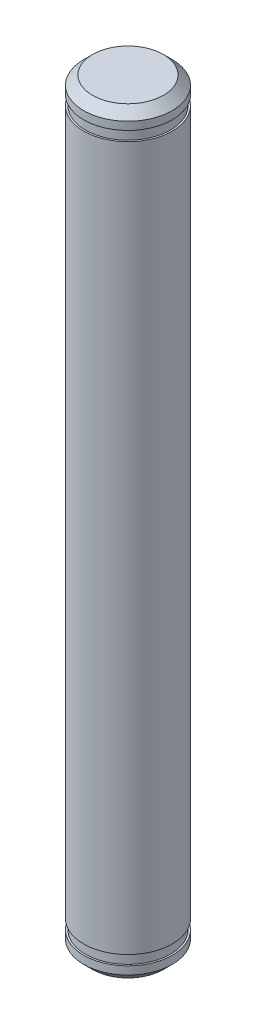
ISO-10303-21;
HEADER;
FILE_DESCRIPTION(('STEP AP214'),'2;1');
FILE_NAME('part.step','',(''),(''),'','','');
FILE_SCHEMA(('AUTOMOTIVE_DESIGN { 1 0 10303 214 1 1 1 1 }'));
ENDSEC;
DATA;
#1=APPLICATION_CONTEXT('core data for automotive mechanical design processes');
#2=APPLICATION_PROTOCOL_DEFINITION('international standard','automotive_design',2000,#1);
#3=PRODUCT_CONTEXT('',#1,'mechanical');
#4=PRODUCT('Part','Part','',(#3));
#5=PRODUCT_RELATED_PRODUCT_CATEGORY('part','',(#4));
#6=PRODUCT_DEFINITION_FORMATION('','',#4);
#7=PRODUCT_DEFINITION_CONTEXT('part definition',#1,'design');
#8=PRODUCT_DEFINITION('design','',#6,#7);
#9=PRODUCT_DEFINITION_SHAPE('','',#8);
#10=(LENGTH_UNIT() NAMED_UNIT(*) SI_UNIT(.MILLI.,.METRE.));
#11=(NAMED_UNIT(*) PLANE_ANGLE_UNIT() SI_UNIT($,.RADIAN.));
#12=(NAMED_UNIT(*) SI_UNIT($,.STERADIAN.) SOLID_ANGLE_UNIT());
#13=UNCERTAINTY_MEASURE_WITH_UNIT(LENGTH_MEASURE(1.E-05),#10,'distance_accuracy_value','');
#14=(GEOMETRIC_REPRESENTATION_CONTEXT(3) GLOBAL_UNCERTAINTY_ASSIGNED_CONTEXT((#13)) GLOBAL_UNIT_ASSIGNED_CONTEXT((#10,
#11,#12)) REPRESENTATION_CONTEXT('',''));
#15=CARTESIAN_POINT('',(0.,0.,0.));
#16=DIRECTION('',(0.,0.,1.));
#17=DIRECTION('',(1.,0.,0.));
#18=AXIS2_PLACEMENT_3D('',#15,#16,#17);
#19=CARTESIAN_POINT('',(0.,42.75,0.));
#20=DIRECTION('',(0.,1.,0.));
#21=DIRECTION('',(0.,0.,1.));
#22=AXIS2_PLACEMENT_3D('',#19,#20,#21);
#23=CYLINDRICAL_SURFACE('',#22,5.);
#24=CARTESIAN_POINT('',(0.,39.75,0.));
#25=DIRECTION('',(0.,1.,0.));
#26=DIRECTION('',(-1.,0.,0.));
#27=AXIS2_PLACEMENT_3D('',#24,#25,#26);
#28=CIRCLE('',#27,4.99999999999999);
#29=CARTESIAN_POINT('',(-4.99999999999998,39.75,0.));
#30=VERTEX_POINT('',#29);
#31=EDGE_CURVE('E57',#30,#30,#28,.T.);
#32=ORIENTED_EDGE('',*,*,#31,.F.);
#33=EDGE_LOOP('',(#32));
#34=FACE_BOUND('',#33,.T.);
#35=CARTESIAN_POINT('',(0.,-39.75,0.));
#36=DIRECTION('',(0.,1.,0.));
#37=DIRECTION('',(-1.,0.,0.));
#38=AXIS2_PLACEMENT_3D('',#35,#36,#37);
#39=CIRCLE('',#38,4.99999999999999);
#40=CARTESIAN_POINT('',(-4.99999999999997,-39.75,0.));
#41=VERTEX_POINT('',#40);
#42=EDGE_CURVE('E69',#41,#41,#39,.T.);
#43=ORIENTED_EDGE('',*,*,#42,.T.);
#44=EDGE_LOOP('',(#43));
#45=FACE_BOUND('',#44,.T.);
#46=ADVANCED_FACE('F35',(#34,#45),#23,.T.);
#47=CARTESIAN_POINT('',(0.,42.75,0.));
#48=DIRECTION('',(0.,-1.,0.));
#49=DIRECTION('',(0.,0.,-1.));
#50=AXIS2_PLACEMENT_3D('',#47,#48,#49);
#51=PLANE('',#50);
#52=CARTESIAN_POINT('',(0.,42.75,0.));
#53=DIRECTION('',(0.,-1.,0.));
#54=DIRECTION('',(0.,0.,-1.));
#55=AXIS2_PLACEMENT_3D('',#52,#53,#54);
#56=CIRCLE('',#55,3.99999999999998);
#57=CARTESIAN_POINT('',(0.,42.75,-3.99999999999998));
#58=VERTEX_POINT('',#57);
#59=EDGE_CURVE('E10',#58,#58,#56,.F.);
#60=ORIENTED_EDGE('',*,*,#59,.T.);
#61=EDGE_LOOP('',(#60));
#62=FACE_BOUND('',#61,.T.);
#63=ADVANCED_FACE('F110',(#62),#51,.F.);
#64=CARTESIAN_POINT('',(0.,40.85,0.));
#65=DIRECTION('',(0.,1.,0.));
#66=DIRECTION('',(-1.,0.,0.));
#67=AXIS2_PLACEMENT_3D('',#64,#65,#66);
#68=CIRCLE('',#67,4.99999999999999);
#69=CARTESIAN_POINT('',(-4.99999999999998,40.85,0.));
#70=VERTEX_POINT('',#69);
#71=EDGE_CURVE('E56',#70,#70,#68,.T.);
#72=ORIENTED_EDGE('',*,*,#71,.T.);
#73=EDGE_LOOP('',(#72));
#74=FACE_BOUND('',#73,.T.);
#75=CARTESIAN_POINT('',(0.,41.75,0.));
#76=DIRECTION('',(0.,-1.,0.));
#77=DIRECTION('',(0.,0.,-1.));
#78=AXIS2_PLACEMENT_3D('',#75,#76,#77);
#79=CIRCLE('',#78,5.);
#80=CARTESIAN_POINT('',(0.,41.75,-5.));
#81=VERTEX_POINT('',#80);
#82=EDGE_CURVE('E51',#81,#81,#79,.T.);
#83=ORIENTED_EDGE('',*,*,#82,.T.);
#84=EDGE_LOOP('',(#83));
#85=FACE_BOUND('',#84,.T.);
#86=ADVANCED_FACE('F97',(#74,#85),#23,.T.);
#87=CARTESIAN_POINT('',(0.,42.75,0.));
#88=DIRECTION('',(0.,-1.,0.));
#89=DIRECTION('',(0.,0.,-1.));
#90=AXIS2_PLACEMENT_3D('',#87,#88,#89);
#91=CONICAL_SURFACE('',#90,3.99999999999998,0.785398163397442);
#92=ORIENTED_EDGE('',*,*,#82,.F.);
#93=EDGE_LOOP('',(#92));
#94=FACE_BOUND('',#93,.T.);
#95=ORIENTED_EDGE('',*,*,#59,.F.);
#96=EDGE_LOOP('',(#95));
#97=FACE_BOUND('',#96,.T.);
#98=ADVANCED_FACE('F38',(#94,#97),#91,.T.);
#99=CARTESIAN_POINT('',(0.,40.85,0.));
#100=DIRECTION('',(0.,1.,0.));
#101=DIRECTION('',(-1.,0.,0.));
#102=AXIS2_PLACEMENT_3D('',#99,#100,#101);
#103=PLANE('',#102);
#104=ORIENTED_EDGE('',*,*,#71,.F.);
#105=EDGE_LOOP('',(#104));
#106=FACE_BOUND('',#105,.T.);
#107=CARTESIAN_POINT('',(0.,40.85,0.));
#108=DIRECTION('',(0.,1.,0.));
#109=DIRECTION('',(-1.,0.,0.));
#110=AXIS2_PLACEMENT_3D('',#107,#108,#109);
#111=CIRCLE('',#110,4.8);
#112=CARTESIAN_POINT('',(-4.79999999999998,40.85,0.));
#113=VERTEX_POINT('',#112);
#114=EDGE_CURVE('E60',#113,#113,#111,.T.);
#115=ORIENTED_EDGE('',*,*,#114,.T.);
#116=EDGE_LOOP('',(#115));
#117=FACE_BOUND('',#116,.T.);
#118=ADVANCED_FACE('F122',(#106,#117),#103,.F.);
#119=CARTESIAN_POINT('',(0.,39.75,0.));
#120=DIRECTION('',(0.,1.,0.));
#121=DIRECTION('',(-1.,0.,0.));
#122=AXIS2_PLACEMENT_3D('',#119,#120,#121);
#123=PLANE('',#122);
#124=ORIENTED_EDGE('',*,*,#31,.T.);
#125=EDGE_LOOP('',(#124));
#126=FACE_BOUND('',#125,.T.);
#127=CARTESIAN_POINT('',(0.,39.75,0.));
#128=DIRECTION('',(0.,1.,0.));
#129=DIRECTION('',(-1.,0.,0.));
#130=AXIS2_PLACEMENT_3D('',#127,#128,#129);
#131=CIRCLE('',#130,4.8);
#132=CARTESIAN_POINT('',(-4.79999999999998,39.75,0.));
#133=VERTEX_POINT('',#132);
#134=EDGE_CURVE('E63',#133,#133,#131,.T.);
#135=ORIENTED_EDGE('',*,*,#134,.F.);
#136=EDGE_LOOP('',(#135));
#137=FACE_BOUND('',#136,.T.);
#138=ADVANCED_FACE('F131',(#126,#137),#123,.T.);
#139=CARTESIAN_POINT('',(0.,40.85,0.));
#140=DIRECTION('',(0.,-1.,0.));
#141=DIRECTION('',(1.,0.,0.));
#142=AXIS2_PLACEMENT_3D('',#139,#140,#141);
#143=CYLINDRICAL_SURFACE('',#142,4.8);
#144=ORIENTED_EDGE('',*,*,#114,.F.);
#145=EDGE_LOOP('',(#144));
#146=FACE_BOUND('',#145,.T.);
#147=ORIENTED_EDGE('',*,*,#134,.T.);
#148=EDGE_LOOP('',(#147));
#149=FACE_BOUND('',#148,.T.);
#150=ADVANCED_FACE('F88',(#146,#149),#143,.T.);
#151=CARTESIAN_POINT('',(0.,-40.85,0.));
#152=DIRECTION('',(0.,-1.,0.));
#153=DIRECTION('',(-1.,0.,0.));
#154=AXIS2_PLACEMENT_3D('',#151,#152,#153);
#155=PLANE('',#154);
#156=CARTESIAN_POINT('',(0.,-40.85,0.));
#157=DIRECTION('',(0.,1.,0.));
#158=DIRECTION('',(-1.,0.,0.));
#159=AXIS2_PLACEMENT_3D('',#156,#157,#158);
#160=CIRCLE('',#159,4.8);
#161=CARTESIAN_POINT('',(-4.79999999999997,-40.85,0.));
#162=VERTEX_POINT('',#161);
#163=EDGE_CURVE('E72',#162,#162,#160,.T.);
#164=ORIENTED_EDGE('',*,*,#163,.F.);
#165=EDGE_LOOP('',(#164));
#166=FACE_BOUND('',#165,.T.);
#167=CARTESIAN_POINT('',(0.,-40.85,0.));
#168=DIRECTION('',(0.,1.,0.));
#169=DIRECTION('',(-1.,0.,0.));
#170=AXIS2_PLACEMENT_3D('',#167,#168,#169);
#171=CIRCLE('',#170,4.99999999999999);
#172=CARTESIAN_POINT('',(-4.99999999999997,-40.85,0.));
#173=VERTEX_POINT('',#172);
#174=EDGE_CURVE('E66',#173,#173,#171,.T.);
#175=ORIENTED_EDGE('',*,*,#174,.T.);
#176=EDGE_LOOP('',(#175));
#177=FACE_BOUND('',#176,.T.);
#178=ADVANCED_FACE('F84',(#166,#177),#155,.F.);
#179=CARTESIAN_POINT('',(0.,-39.75,0.));
#180=DIRECTION('',(0.,-1.,0.));
#181=DIRECTION('',(-1.,0.,0.));
#182=AXIS2_PLACEMENT_3D('',#179,#180,#181);
#183=PLANE('',#182);
#184=CARTESIAN_POINT('',(0.,-39.75,0.));
#185=DIRECTION('',(0.,1.,0.));
#186=DIRECTION('',(-1.,0.,0.));
#187=AXIS2_PLACEMENT_3D('',#184,#185,#186);
#188=CIRCLE('',#187,4.8);
#189=CARTESIAN_POINT('',(-4.79999999999997,-39.75,0.));
#190=VERTEX_POINT('',#189);
#191=EDGE_CURVE('E75',#190,#190,#188,.T.);
#192=ORIENTED_EDGE('',*,*,#191,.T.);
#193=EDGE_LOOP('',(#192));
#194=FACE_BOUND('',#193,.T.);
#195=ORIENTED_EDGE('',*,*,#42,.F.);
#196=EDGE_LOOP('',(#195));
#197=FACE_BOUND('',#196,.T.);
#198=ADVANCED_FACE('F87',(#194,#197),#183,.T.);
#199=CARTESIAN_POINT('',(0.,-40.85,0.));
#200=DIRECTION('',(0.,1.,0.));
#201=DIRECTION('',(-1.,0.,0.));
#202=AXIS2_PLACEMENT_3D('',#199,#200,#201);
#203=CYLINDRICAL_SURFACE('',#202,4.8);
#204=ORIENTED_EDGE('',*,*,#163,.T.);
#205=EDGE_LOOP('',(#204));
#206=FACE_BOUND('',#205,.T.);
#207=ORIENTED_EDGE('',*,*,#191,.F.);
#208=EDGE_LOOP('',(#207));
#209=FACE_BOUND('',#208,.T.);
#210=ADVANCED_FACE('F81',(#206,#209),#203,.T.);
#211=CARTESIAN_POINT('',(5.00000000000001,-42.75,0.));
#212=DIRECTION('',(0.,1.,0.));
#213=DIRECTION('',(0.,0.,1.));
#214=AXIS2_PLACEMENT_3D('',#211,#212,#213);
#215=PLANE('',#214);
#216=CARTESIAN_POINT('',(0.,-42.75,0.));
#217=DIRECTION('',(0.,1.,0.));
#218=DIRECTION('',(0.,0.,1.));
#219=AXIS2_PLACEMENT_3D('',#216,#217,#218);
#220=CIRCLE('',#219,3.99999999999998);
#221=CARTESIAN_POINT('',(0.,-42.75,3.99999999999998));
#222=VERTEX_POINT('',#221);
#223=EDGE_CURVE('E43',#222,#222,#220,.F.);
#224=ORIENTED_EDGE('',*,*,#223,.T.);
#225=EDGE_LOOP('',(#224));
#226=FACE_BOUND('',#225,.T.);
#227=ADVANCED_FACE('F101',(#226),#215,.F.);
#228=CARTESIAN_POINT('',(0.,-41.75,0.));
#229=DIRECTION('',(0.,1.,0.));
#230=DIRECTION('',(0.,0.,1.));
#231=AXIS2_PLACEMENT_3D('',#228,#229,#230);
#232=CONICAL_SURFACE('',#231,5.,0.785398163397453);
#233=ORIENTED_EDGE('',*,*,#223,.F.);
#234=EDGE_LOOP('',(#233));
#235=FACE_BOUND('',#234,.T.);
#236=CARTESIAN_POINT('',(0.,-41.75,0.));
#237=DIRECTION('',(0.,1.,0.));
#238=DIRECTION('',(0.,0.,1.));
#239=AXIS2_PLACEMENT_3D('',#236,#237,#238);
#240=CIRCLE('',#239,5.);
#241=CARTESIAN_POINT('',(0.,-41.75,5.));
#242=VERTEX_POINT('',#241);
#243=EDGE_CURVE('E47',#242,#242,#240,.T.);
#244=ORIENTED_EDGE('',*,*,#243,.F.);
#245=EDGE_LOOP('',(#244));
#246=FACE_BOUND('',#245,.T.);
#247=ADVANCED_FACE('F95',(#235,#246),#232,.T.);
#248=ORIENTED_EDGE('',*,*,#174,.F.);
#249=EDGE_LOOP('',(#248));
#250=FACE_BOUND('',#249,.T.);
#251=ORIENTED_EDGE('',*,*,#243,.T.);
#252=EDGE_LOOP('',(#251));
#253=FACE_BOUND('',#252,.T.);
#254=ADVANCED_FACE('F92',(#250,#253),#23,.T.);
#255=CLOSED_SHELL('',(#46,#63,#86,#98,#118,#138,#150,#178,#198,#210,#227,#247,#254));
#256=MANIFOLD_SOLID_BREP('B2',#255);
#257=ADVANCED_BREP_SHAPE_REPRESENTATION('',(#18,#256),#14);
#258=SHAPE_DEFINITION_REPRESENTATION(#9,#257);
ENDSEC;
END-ISO-10303-21;
